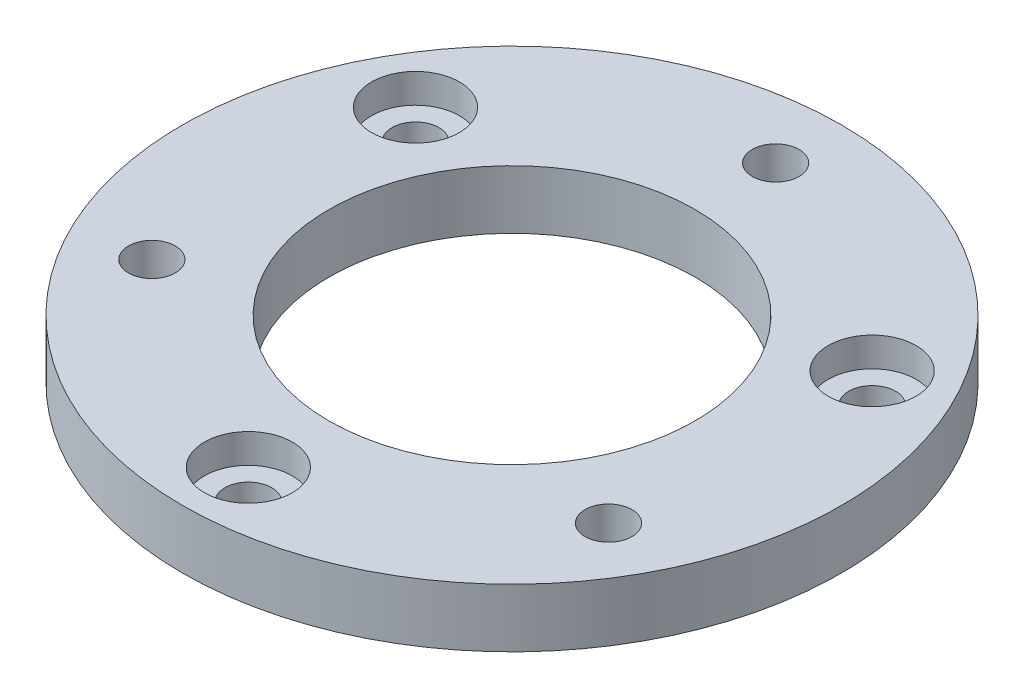
ISO-10303-21;
HEADER;
FILE_DESCRIPTION(('STEP AP214'),'2;1');
FILE_NAME('part.step','',(''),(''),'','','');
FILE_SCHEMA(('AUTOMOTIVE_DESIGN { 1 0 10303 214 1 1 1 1 }'));
ENDSEC;
DATA;
#1=APPLICATION_CONTEXT('core data for automotive mechanical design processes');
#2=APPLICATION_PROTOCOL_DEFINITION('international standard','automotive_design',2000,#1);
#3=PRODUCT_CONTEXT('',#1,'mechanical');
#4=PRODUCT('Part','Part','',(#3));
#5=PRODUCT_RELATED_PRODUCT_CATEGORY('part','',(#4));
#6=PRODUCT_DEFINITION_FORMATION('','',#4);
#7=PRODUCT_DEFINITION_CONTEXT('part definition',#1,'design');
#8=PRODUCT_DEFINITION('design','',#6,#7);
#9=PRODUCT_DEFINITION_SHAPE('','',#8);
#10=(LENGTH_UNIT() NAMED_UNIT(*) SI_UNIT(.MILLI.,.METRE.));
#11=(NAMED_UNIT(*) PLANE_ANGLE_UNIT() SI_UNIT($,.RADIAN.));
#12=(NAMED_UNIT(*) SI_UNIT($,.STERADIAN.) SOLID_ANGLE_UNIT());
#13=UNCERTAINTY_MEASURE_WITH_UNIT(LENGTH_MEASURE(1.E-05),#10,'distance_accuracy_value','');
#14=(GEOMETRIC_REPRESENTATION_CONTEXT(3) GLOBAL_UNCERTAINTY_ASSIGNED_CONTEXT((#13)) GLOBAL_UNIT_ASSIGNED_CONTEXT((#10,
#11,#12)) REPRESENTATION_CONTEXT('',''));
#15=CARTESIAN_POINT('',(0.,0.,0.));
#16=DIRECTION('',(0.,0.,1.));
#17=DIRECTION('',(1.,0.,0.));
#18=AXIS2_PLACEMENT_3D('',#15,#16,#17);
#19=CARTESIAN_POINT('',(15.5884572681203,4.,-9.00000000000067));
#20=DIRECTION('',(0.,-1.,0.));
#21=DIRECTION('',(0.,0.,-1.));
#22=AXIS2_PLACEMENT_3D('',#19,#20,#21);
#23=CYLINDRICAL_SURFACE('',#22,1.60000000000022);
#24=CARTESIAN_POINT('',(15.5884572681203,0.,-9.00000000000067));
#25=DIRECTION('',(0.,1.,0.));
#26=DIRECTION('',(0.,0.,1.));
#27=AXIS2_PLACEMENT_3D('',#24,#25,#26);
#28=CIRCLE('',#27,1.60000000000022);
#29=CARTESIAN_POINT('',(15.5884572681203,0.,-7.40000000000045));
#30=VERTEX_POINT('',#29);
#31=EDGE_CURVE('E82',#30,#30,#28,.T.);
#32=ORIENTED_EDGE('',*,*,#31,.F.);
#33=EDGE_LOOP('',(#32));
#34=FACE_BOUND('',#33,.T.);
#35=CARTESIAN_POINT('',(15.5884572681203,2.,-9.00000000000067));
#36=DIRECTION('',(0.,1.,0.));
#37=DIRECTION('',(0.,0.,1.));
#38=AXIS2_PLACEMENT_3D('',#35,#36,#37);
#39=CIRCLE('',#38,1.60000000000022);
#40=CARTESIAN_POINT('',(15.5884572681203,2.,-7.40000000000045));
#41=VERTEX_POINT('',#40);
#42=EDGE_CURVE('E35',#41,#41,#39,.T.);
#43=ORIENTED_EDGE('',*,*,#42,.T.);
#44=EDGE_LOOP('',(#43));
#45=FACE_BOUND('',#44,.T.);
#46=ADVANCED_FACE('F31',(#34,#45),#23,.F.);
#47=CARTESIAN_POINT('',(1.52815921652642E-12,4.,18.));
#48=DIRECTION('',(0.,-1.,0.));
#49=DIRECTION('',(0.,0.,-1.));
#50=AXIS2_PLACEMENT_3D('',#47,#48,#49);
#51=CYLINDRICAL_SURFACE('',#50,1.60000000000158);
#52=CARTESIAN_POINT('',(1.52815921652642E-12,0.,18.));
#53=DIRECTION('',(0.,1.,0.));
#54=DIRECTION('',(0.,0.,1.));
#55=AXIS2_PLACEMENT_3D('',#52,#53,#54);
#56=CIRCLE('',#55,1.60000000000158);
#57=CARTESIAN_POINT('',(1.52815921652642E-12,0.,19.6000000000016));
#58=VERTEX_POINT('',#57);
#59=EDGE_CURVE('E74',#58,#58,#56,.T.);
#60=ORIENTED_EDGE('',*,*,#59,.F.);
#61=EDGE_LOOP('',(#60));
#62=FACE_BOUND('',#61,.T.);
#63=CARTESIAN_POINT('',(1.52815921652642E-12,2.,18.));
#64=DIRECTION('',(0.,1.,0.));
#65=DIRECTION('',(0.,0.,1.));
#66=AXIS2_PLACEMENT_3D('',#63,#64,#65);
#67=CIRCLE('',#66,1.60000000000158);
#68=CARTESIAN_POINT('',(1.52815921652642E-12,2.,19.6000000000016));
#69=VERTEX_POINT('',#68);
#70=EDGE_CURVE('E52',#69,#69,#67,.T.);
#71=ORIENTED_EDGE('',*,*,#70,.T.);
#72=EDGE_LOOP('',(#71));
#73=FACE_BOUND('',#72,.T.);
#74=ADVANCED_FACE('F115',(#62,#73),#51,.F.);
#75=CARTESIAN_POINT('',(-15.5884572681195,4.,-8.99999999999933));
#76=DIRECTION('',(0.,-1.,0.));
#77=DIRECTION('',(0.,0.,-1.));
#78=AXIS2_PLACEMENT_3D('',#75,#76,#77);
#79=CYLINDRICAL_SURFACE('',#78,1.60000000000077);
#80=CARTESIAN_POINT('',(-15.5884572681195,0.,-8.99999999999933));
#81=DIRECTION('',(0.,1.,0.));
#82=DIRECTION('',(0.,0.,1.));
#83=AXIS2_PLACEMENT_3D('',#80,#81,#82);
#84=CIRCLE('',#83,1.60000000000077);
#85=CARTESIAN_POINT('',(-15.5884572681195,0.,-7.39999999999855));
#86=VERTEX_POINT('',#85);
#87=EDGE_CURVE('E58',#86,#86,#84,.T.);
#88=ORIENTED_EDGE('',*,*,#87,.F.);
#89=EDGE_LOOP('',(#88));
#90=FACE_BOUND('',#89,.T.);
#91=CARTESIAN_POINT('',(-15.5884572681195,2.,-8.99999999999933));
#92=DIRECTION('',(0.,1.,0.));
#93=DIRECTION('',(0.,0.,1.));
#94=AXIS2_PLACEMENT_3D('',#91,#92,#93);
#95=CIRCLE('',#94,1.60000000000077);
#96=CARTESIAN_POINT('',(-15.5884572681195,2.,-7.39999999999855));
#97=VERTEX_POINT('',#96);
#98=EDGE_CURVE('E50',#97,#97,#95,.T.);
#99=ORIENTED_EDGE('',*,*,#98,.T.);
#100=EDGE_LOOP('',(#99));
#101=FACE_BOUND('',#100,.T.);
#102=ADVANCED_FACE('F121',(#90,#101),#79,.F.);
#103=CARTESIAN_POINT('',(0.,4.,0.));
#104=DIRECTION('',(0.,1.,0.));
#105=DIRECTION('',(0.,0.,1.));
#106=AXIS2_PLACEMENT_3D('',#103,#104,#105);
#107=PLANE('',#106);
#108=CARTESIAN_POINT('',(-15.5884572681195,4.,-8.99999999999933));
#109=DIRECTION('',(0.,1.,0.));
#110=DIRECTION('',(0.,0.,1.));
#111=AXIS2_PLACEMENT_3D('',#108,#109,#110);
#112=CIRCLE('',#111,3.);
#113=CARTESIAN_POINT('',(-15.5884572681195,4.,-5.99999999999933));
#114=VERTEX_POINT('',#113);
#115=EDGE_CURVE('E166',#114,#114,#112,.T.);
#116=ORIENTED_EDGE('',*,*,#115,.F.);
#117=EDGE_LOOP('',(#116));
#118=FACE_BOUND('',#117,.T.);
#119=CARTESIAN_POINT('',(15.5884572681203,4.,-9.00000000000067));
#120=DIRECTION('',(0.,1.,0.));
#121=DIRECTION('',(0.,0.,1.));
#122=AXIS2_PLACEMENT_3D('',#119,#120,#121);
#123=CIRCLE('',#122,3.);
#124=CARTESIAN_POINT('',(15.5884572681203,4.,-6.00000000000067));
#125=VERTEX_POINT('',#124);
#126=EDGE_CURVE('E174',#125,#125,#123,.T.);
#127=ORIENTED_EDGE('',*,*,#126,.F.);
#128=EDGE_LOOP('',(#127));
#129=FACE_BOUND('',#128,.T.);
#130=CARTESIAN_POINT('',(1.52815921652642E-12,4.,18.));
#131=DIRECTION('',(0.,1.,0.));
#132=DIRECTION('',(0.,0.,1.));
#133=AXIS2_PLACEMENT_3D('',#130,#131,#132);
#134=CIRCLE('',#133,3.);
#135=CARTESIAN_POINT('',(1.52815921652642E-12,4.,21.));
#136=VERTEX_POINT('',#135);
#137=EDGE_CURVE('E71',#136,#136,#134,.T.);
#138=ORIENTED_EDGE('',*,*,#137,.F.);
#139=EDGE_LOOP('',(#138));
#140=FACE_BOUND('',#139,.T.);
#141=CARTESIAN_POINT('',(-15.5884572681187,4.,9.00000000000067));
#142=DIRECTION('',(0.,1.,0.));
#143=DIRECTION('',(0.,0.,1.));
#144=AXIS2_PLACEMENT_3D('',#141,#142,#143);
#145=CIRCLE('',#144,1.60000000000146);
#146=CARTESIAN_POINT('',(-15.5884572681187,4.,10.6000000000021));
#147=VERTEX_POINT('',#146);
#148=EDGE_CURVE('E67',#147,#147,#145,.T.);
#149=ORIENTED_EDGE('',*,*,#148,.F.);
#150=EDGE_LOOP('',(#149));
#151=FACE_BOUND('',#150,.T.);
#152=CARTESIAN_POINT('',(15.588457268121,4.,8.99999999999934));
#153=DIRECTION('',(0.,1.,0.));
#154=DIRECTION('',(0.,0.,1.));
#155=AXIS2_PLACEMENT_3D('',#152,#153,#154);
#156=CIRCLE('',#155,1.60000000000099);
#157=CARTESIAN_POINT('',(15.588457268121,4.,10.6000000000003));
#158=VERTEX_POINT('',#157);
#159=EDGE_CURVE('E79',#158,#158,#156,.T.);
#160=ORIENTED_EDGE('',*,*,#159,.F.);
#161=EDGE_LOOP('',(#160));
#162=FACE_BOUND('',#161,.T.);
#163=CARTESIAN_POINT('',(0.,4.,0.));
#164=DIRECTION('',(0.,1.,0.));
#165=DIRECTION('',(0.,0.,1.));
#166=AXIS2_PLACEMENT_3D('',#163,#164,#165);
#167=CIRCLE('',#166,12.5);
#168=CARTESIAN_POINT('',(0.,4.,12.5));
#169=VERTEX_POINT('',#168);
#170=EDGE_CURVE('E88',#169,#169,#167,.T.);
#171=ORIENTED_EDGE('',*,*,#170,.F.);
#172=EDGE_LOOP('',(#171));
#173=FACE_BOUND('',#172,.T.);
#174=CARTESIAN_POINT('',(0.,4.,0.));
#175=DIRECTION('',(0.,1.,0.));
#176=DIRECTION('',(0.,0.,1.));
#177=AXIS2_PLACEMENT_3D('',#174,#175,#176);
#178=CIRCLE('',#177,22.5);
#179=CARTESIAN_POINT('',(0.,4.,22.5));
#180=VERTEX_POINT('',#179);
#181=EDGE_CURVE('E10',#180,#180,#178,.T.);
#182=ORIENTED_EDGE('',*,*,#181,.T.);
#183=EDGE_LOOP('',(#182));
#184=FACE_BOUND('',#183,.T.);
#185=CARTESIAN_POINT('',(0.,4.,-18.));
#186=DIRECTION('',(0.,1.,0.));
#187=DIRECTION('',(0.,0.,1.));
#188=AXIS2_PLACEMENT_3D('',#185,#186,#187);
#189=CIRCLE('',#188,1.6);
#190=CARTESIAN_POINT('',(0.,4.,-16.4));
#191=VERTEX_POINT('',#190);
#192=EDGE_CURVE('E44',#191,#191,#189,.T.);
#193=ORIENTED_EDGE('',*,*,#192,.F.);
#194=EDGE_LOOP('',(#193));
#195=FACE_BOUND('',#194,.T.);
#196=ADVANCED_FACE('F136',(#118,#129,#140,#151,#162,#173,#184,#195),#107,.T.);
#197=CARTESIAN_POINT('',(0.,0.,0.));
#198=DIRECTION('',(0.,1.,0.));
#199=DIRECTION('',(0.,0.,1.));
#200=AXIS2_PLACEMENT_3D('',#197,#198,#199);
#201=PLANE('',#200);
#202=CARTESIAN_POINT('',(0.,0.,0.));
#203=DIRECTION('',(0.,1.,0.));
#204=DIRECTION('',(0.,0.,1.));
#205=AXIS2_PLACEMENT_3D('',#202,#203,#204);
#206=CIRCLE('',#205,22.5);
#207=CARTESIAN_POINT('',(0.,0.,22.5));
#208=VERTEX_POINT('',#207);
#209=EDGE_CURVE('E39',#208,#208,#206,.T.);
#210=ORIENTED_EDGE('',*,*,#209,.F.);
#211=EDGE_LOOP('',(#210));
#212=FACE_BOUND('',#211,.T.);
#213=CARTESIAN_POINT('',(0.,0.,-18.));
#214=DIRECTION('',(0.,1.,0.));
#215=DIRECTION('',(0.,0.,1.));
#216=AXIS2_PLACEMENT_3D('',#213,#214,#215);
#217=CIRCLE('',#216,1.6);
#218=CARTESIAN_POINT('',(0.,0.,-16.4));
#219=VERTEX_POINT('',#218);
#220=EDGE_CURVE('E47',#219,#219,#217,.T.);
#221=ORIENTED_EDGE('',*,*,#220,.T.);
#222=EDGE_LOOP('',(#221));
#223=FACE_BOUND('',#222,.T.);
#224=CARTESIAN_POINT('',(0.,0.,0.));
#225=DIRECTION('',(0.,1.,0.));
#226=DIRECTION('',(0.,0.,1.));
#227=AXIS2_PLACEMENT_3D('',#224,#225,#226);
#228=CIRCLE('',#227,12.5);
#229=CARTESIAN_POINT('',(0.,0.,12.5));
#230=VERTEX_POINT('',#229);
#231=EDGE_CURVE('E87',#230,#230,#228,.T.);
#232=ORIENTED_EDGE('',*,*,#231,.T.);
#233=EDGE_LOOP('',(#232));
#234=FACE_BOUND('',#233,.T.);
#235=ORIENTED_EDGE('',*,*,#31,.T.);
#236=EDGE_LOOP('',(#235));
#237=FACE_BOUND('',#236,.T.);
#238=CARTESIAN_POINT('',(15.588457268121,0.,8.99999999999934));
#239=DIRECTION('',(0.,1.,0.));
#240=DIRECTION('',(0.,0.,1.));
#241=AXIS2_PLACEMENT_3D('',#238,#239,#240);
#242=CIRCLE('',#241,1.60000000000099);
#243=CARTESIAN_POINT('',(15.588457268121,0.,10.6000000000003));
#244=VERTEX_POINT('',#243);
#245=EDGE_CURVE('E78',#244,#244,#242,.T.);
#246=ORIENTED_EDGE('',*,*,#245,.T.);
#247=EDGE_LOOP('',(#246));
#248=FACE_BOUND('',#247,.T.);
#249=ORIENTED_EDGE('',*,*,#59,.T.);
#250=EDGE_LOOP('',(#249));
#251=FACE_BOUND('',#250,.T.);
#252=CARTESIAN_POINT('',(-15.5884572681187,0.,9.00000000000067));
#253=DIRECTION('',(0.,1.,0.));
#254=DIRECTION('',(0.,0.,1.));
#255=AXIS2_PLACEMENT_3D('',#252,#253,#254);
#256=CIRCLE('',#255,1.60000000000146);
#257=CARTESIAN_POINT('',(-15.5884572681187,0.,10.6000000000021));
#258=VERTEX_POINT('',#257);
#259=EDGE_CURVE('E62',#258,#258,#256,.T.);
#260=ORIENTED_EDGE('',*,*,#259,.T.);
#261=EDGE_LOOP('',(#260));
#262=FACE_BOUND('',#261,.T.);
#263=ORIENTED_EDGE('',*,*,#87,.T.);
#264=EDGE_LOOP('',(#263));
#265=FACE_BOUND('',#264,.T.);
#266=ADVANCED_FACE('F98',(#212,#223,#234,#237,#248,#251,#262,#265),#201,.F.);
#267=CARTESIAN_POINT('',(0.,4.,0.));
#268=DIRECTION('',(0.,-1.,0.));
#269=DIRECTION('',(0.,0.,-1.));
#270=AXIS2_PLACEMENT_3D('',#267,#268,#269);
#271=CYLINDRICAL_SURFACE('',#270,22.5);
#272=ORIENTED_EDGE('',*,*,#181,.F.);
#273=EDGE_LOOP('',(#272));
#274=FACE_BOUND('',#273,.T.);
#275=ORIENTED_EDGE('',*,*,#209,.T.);
#276=EDGE_LOOP('',(#275));
#277=FACE_BOUND('',#276,.T.);
#278=ADVANCED_FACE('F33',(#274,#277),#271,.T.);
#279=CARTESIAN_POINT('',(0.,4.,-18.));
#280=DIRECTION('',(0.,-1.,0.));
#281=DIRECTION('',(0.,0.,-1.));
#282=AXIS2_PLACEMENT_3D('',#279,#280,#281);
#283=CYLINDRICAL_SURFACE('',#282,1.6);
#284=ORIENTED_EDGE('',*,*,#192,.T.);
#285=EDGE_LOOP('',(#284));
#286=FACE_BOUND('',#285,.T.);
#287=ORIENTED_EDGE('',*,*,#220,.F.);
#288=EDGE_LOOP('',(#287));
#289=FACE_BOUND('',#288,.T.);
#290=ADVANCED_FACE('F101',(#286,#289),#283,.F.);
#291=CARTESIAN_POINT('',(0.,4.,0.));
#292=DIRECTION('',(0.,-1.,0.));
#293=DIRECTION('',(0.,0.,-1.));
#294=AXIS2_PLACEMENT_3D('',#291,#292,#293);
#295=CYLINDRICAL_SURFACE('',#294,12.5);
#296=ORIENTED_EDGE('',*,*,#170,.T.);
#297=EDGE_LOOP('',(#296));
#298=FACE_BOUND('',#297,.T.);
#299=ORIENTED_EDGE('',*,*,#231,.F.);
#300=EDGE_LOOP('',(#299));
#301=FACE_BOUND('',#300,.T.);
#302=ADVANCED_FACE('F103',(#298,#301),#295,.F.);
#303=CARTESIAN_POINT('',(15.588457268121,4.,8.99999999999934));
#304=DIRECTION('',(0.,-1.,0.));
#305=DIRECTION('',(0.,0.,-1.));
#306=AXIS2_PLACEMENT_3D('',#303,#304,#305);
#307=CYLINDRICAL_SURFACE('',#306,1.60000000000099);
#308=ORIENTED_EDGE('',*,*,#159,.T.);
#309=EDGE_LOOP('',(#308));
#310=FACE_BOUND('',#309,.T.);
#311=ORIENTED_EDGE('',*,*,#245,.F.);
#312=EDGE_LOOP('',(#311));
#313=FACE_BOUND('',#312,.T.);
#314=ADVANCED_FACE('F109',(#310,#313),#307,.F.);
#315=CARTESIAN_POINT('',(-15.5884572681187,4.,9.00000000000067));
#316=DIRECTION('',(0.,-1.,0.));
#317=DIRECTION('',(0.,0.,-1.));
#318=AXIS2_PLACEMENT_3D('',#315,#316,#317);
#319=CYLINDRICAL_SURFACE('',#318,1.60000000000146);
#320=ORIENTED_EDGE('',*,*,#148,.T.);
#321=EDGE_LOOP('',(#320));
#322=FACE_BOUND('',#321,.T.);
#323=ORIENTED_EDGE('',*,*,#259,.F.);
#324=EDGE_LOOP('',(#323));
#325=FACE_BOUND('',#324,.T.);
#326=ADVANCED_FACE('F127',(#322,#325),#319,.F.);
#327=CARTESIAN_POINT('',(-15.5884572681195,2.,-8.99999999999933));
#328=DIRECTION('',(0.,1.,0.));
#329=DIRECTION('',(0.,0.,1.));
#330=AXIS2_PLACEMENT_3D('',#327,#328,#329);
#331=CYLINDRICAL_SURFACE('',#330,3.);
#332=CARTESIAN_POINT('',(-15.5884572681195,2.,-8.99999999999933));
#333=DIRECTION('',(0.,1.,0.));
#334=DIRECTION('',(0.,0.,1.));
#335=AXIS2_PLACEMENT_3D('',#332,#333,#334);
#336=CIRCLE('',#335,3.);
#337=CARTESIAN_POINT('',(-15.5884572681195,2.,-5.99999999999933));
#338=VERTEX_POINT('',#337);
#339=EDGE_CURVE('E53',#338,#338,#336,.T.);
#340=ORIENTED_EDGE('',*,*,#339,.F.);
#341=EDGE_LOOP('',(#340));
#342=FACE_BOUND('',#341,.T.);
#343=ORIENTED_EDGE('',*,*,#115,.T.);
#344=EDGE_LOOP('',(#343));
#345=FACE_BOUND('',#344,.T.);
#346=ADVANCED_FACE('F132',(#342,#345),#331,.F.);
#347=CARTESIAN_POINT('',(-15.5884572681195,2.,-8.99999999999933));
#348=DIRECTION('',(0.,1.,0.));
#349=DIRECTION('',(0.,0.,1.));
#350=AXIS2_PLACEMENT_3D('',#347,#348,#349);
#351=PLANE('',#350);
#352=ORIENTED_EDGE('',*,*,#98,.F.);
#353=EDGE_LOOP('',(#352));
#354=FACE_BOUND('',#353,.T.);
#355=ORIENTED_EDGE('',*,*,#339,.T.);
#356=EDGE_LOOP('',(#355));
#357=FACE_BOUND('',#356,.T.);
#358=ADVANCED_FACE('F142',(#354,#357),#351,.T.);
#359=CARTESIAN_POINT('',(1.52815921652642E-12,2.,18.));
#360=DIRECTION('',(0.,1.,0.));
#361=DIRECTION('',(0.,0.,1.));
#362=AXIS2_PLACEMENT_3D('',#359,#360,#361);
#363=CYLINDRICAL_SURFACE('',#362,3.);
#364=CARTESIAN_POINT('',(1.52815921652642E-12,2.,18.));
#365=DIRECTION('',(0.,1.,0.));
#366=DIRECTION('',(0.,0.,1.));
#367=AXIS2_PLACEMENT_3D('',#364,#365,#366);
#368=CIRCLE('',#367,3.);
#369=CARTESIAN_POINT('',(1.52815921652642E-12,2.,21.));
#370=VERTEX_POINT('',#369);
#371=EDGE_CURVE('E176',#370,#370,#368,.T.);
#372=ORIENTED_EDGE('',*,*,#371,.F.);
#373=EDGE_LOOP('',(#372));
#374=FACE_BOUND('',#373,.T.);
#375=ORIENTED_EDGE('',*,*,#137,.T.);
#376=EDGE_LOOP('',(#375));
#377=FACE_BOUND('',#376,.T.);
#378=ADVANCED_FACE('F138',(#374,#377),#363,.F.);
#379=CARTESIAN_POINT('',(1.52815921652642E-12,2.,18.));
#380=DIRECTION('',(0.,1.,0.));
#381=DIRECTION('',(0.,0.,1.));
#382=AXIS2_PLACEMENT_3D('',#379,#380,#381);
#383=PLANE('',#382);
#384=ORIENTED_EDGE('',*,*,#70,.F.);
#385=EDGE_LOOP('',(#384));
#386=FACE_BOUND('',#385,.T.);
#387=ORIENTED_EDGE('',*,*,#371,.T.);
#388=EDGE_LOOP('',(#387));
#389=FACE_BOUND('',#388,.T.);
#390=ADVANCED_FACE('F141',(#386,#389),#383,.T.);
#391=CARTESIAN_POINT('',(15.5884572681203,2.,-9.00000000000067));
#392=DIRECTION('',(0.,1.,0.));
#393=DIRECTION('',(0.,0.,1.));
#394=AXIS2_PLACEMENT_3D('',#391,#392,#393);
#395=CYLINDRICAL_SURFACE('',#394,3.);
#396=CARTESIAN_POINT('',(15.5884572681203,2.,-9.00000000000067));
#397=DIRECTION('',(0.,1.,0.));
#398=DIRECTION('',(0.,0.,1.));
#399=AXIS2_PLACEMENT_3D('',#396,#397,#398);
#400=CIRCLE('',#399,3.);
#401=CARTESIAN_POINT('',(15.5884572681203,2.,-6.00000000000067));
#402=VERTEX_POINT('',#401);
#403=EDGE_CURVE('E169',#402,#402,#400,.T.);
#404=ORIENTED_EDGE('',*,*,#403,.F.);
#405=EDGE_LOOP('',(#404));
#406=FACE_BOUND('',#405,.T.);
#407=ORIENTED_EDGE('',*,*,#126,.T.);
#408=EDGE_LOOP('',(#407));
#409=FACE_BOUND('',#408,.T.);
#410=ADVANCED_FACE('F146',(#406,#409),#395,.F.);
#411=CARTESIAN_POINT('',(15.5884572681203,2.,-9.00000000000067));
#412=DIRECTION('',(0.,1.,0.));
#413=DIRECTION('',(0.,0.,1.));
#414=AXIS2_PLACEMENT_3D('',#411,#412,#413);
#415=PLANE('',#414);
#416=ORIENTED_EDGE('',*,*,#42,.F.);
#417=EDGE_LOOP('',(#416));
#418=FACE_BOUND('',#417,.T.);
#419=ORIENTED_EDGE('',*,*,#403,.T.);
#420=EDGE_LOOP('',(#419));
#421=FACE_BOUND('',#420,.T.);
#422=ADVANCED_FACE('F150',(#418,#421),#415,.T.);
#423=CLOSED_SHELL('',(#46,#74,#102,#196,#266,#278,#290,#302,#314,#326,#346,#358,#378,#390,#410,#422));
#424=MANIFOLD_SOLID_BREP('B2',#423);
#425=ADVANCED_BREP_SHAPE_REPRESENTATION('',(#18,#424),#14);
#426=SHAPE_DEFINITION_REPRESENTATION(#9,#425);
ENDSEC;
END-ISO-10303-21;
